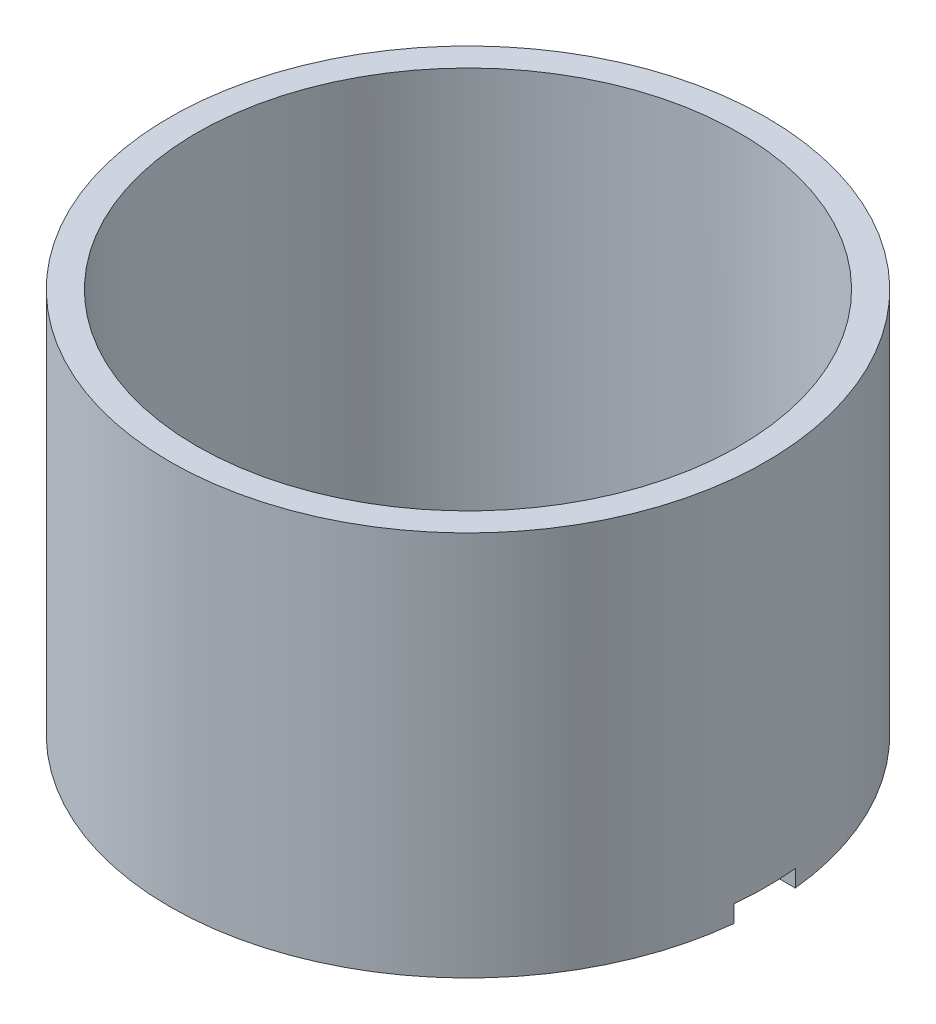
ISO-10303-21;
HEADER;
FILE_DESCRIPTION(('STEP AP214'),'2;1');
FILE_NAME('part.step','',(''),(''),'','','');
FILE_SCHEMA(('AUTOMOTIVE_DESIGN { 1 0 10303 214 1 1 1 1 }'));
ENDSEC;
DATA;
#1=APPLICATION_CONTEXT('core data for automotive mechanical design processes');
#2=APPLICATION_PROTOCOL_DEFINITION('international standard','automotive_design',2000,#1);
#3=PRODUCT_CONTEXT('',#1,'mechanical');
#4=PRODUCT('Part','Part','',(#3));
#5=PRODUCT_RELATED_PRODUCT_CATEGORY('part','',(#4));
#6=PRODUCT_DEFINITION_FORMATION('','',#4);
#7=PRODUCT_DEFINITION_CONTEXT('part definition',#1,'design');
#8=PRODUCT_DEFINITION('design','',#6,#7);
#9=PRODUCT_DEFINITION_SHAPE('','',#8);
#10=(LENGTH_UNIT() NAMED_UNIT(*) SI_UNIT(.MILLI.,.METRE.));
#11=(NAMED_UNIT(*) PLANE_ANGLE_UNIT() SI_UNIT($,.RADIAN.));
#12=(NAMED_UNIT(*) SI_UNIT($,.STERADIAN.) SOLID_ANGLE_UNIT());
#13=UNCERTAINTY_MEASURE_WITH_UNIT(LENGTH_MEASURE(1.E-05),#10,'distance_accuracy_value','');
#14=(GEOMETRIC_REPRESENTATION_CONTEXT(3) GLOBAL_UNCERTAINTY_ASSIGNED_CONTEXT((#13)) GLOBAL_UNIT_ASSIGNED_CONTEXT((#10,
#11,#12)) REPRESENTATION_CONTEXT('',''));
#15=CARTESIAN_POINT('',(0.,0.,0.));
#16=DIRECTION('',(0.,0.,1.));
#17=DIRECTION('',(1.,0.,0.));
#18=AXIS2_PLACEMENT_3D('',#15,#16,#17);
#19=CARTESIAN_POINT('',(0.,-0.6,0.));
#20=DIRECTION('',(0.,1.,0.));
#21=DIRECTION('',(0.,0.,1.));
#22=AXIS2_PLACEMENT_3D('',#19,#20,#21);
#23=PLANE('',#22);
#24=CARTESIAN_POINT('',(0.,-0.6,0.));
#25=DIRECTION('',(0.,1.,0.));
#26=DIRECTION('',(0.,0.,1.));
#27=AXIS2_PLACEMENT_3D('',#24,#25,#26);
#28=CIRCLE('',#27,10.5);
#29=CARTESIAN_POINT('',(10.4443094553924,-0.6,-1.08));
#30=VERTEX_POINT('',#29);
#31=CARTESIAN_POINT('',(-10.4443094553924,-0.6,-1.08));
#32=VERTEX_POINT('',#31);
#33=EDGE_CURVE('E141',#30,#32,#28,.T.);
#34=ORIENTED_EDGE('',*,*,#33,.F.);
#35=DIRECTION('',(-1.,0.,0.));
#36=VECTOR('',#35,1.);
#37=CARTESIAN_POINT('',(0.,-0.6,-1.08));
#38=LINE('',#37,#36);
#39=CARTESIAN_POINT('',(9.48873542681004,-0.6,-1.08));
#40=VERTEX_POINT('',#39);
#41=EDGE_CURVE('E171',#30,#40,#38,.T.);
#42=ORIENTED_EDGE('',*,*,#41,.T.);
#43=CARTESIAN_POINT('',(0.,-0.6,0.));
#44=DIRECTION('',(0.,1.,0.));
#45=DIRECTION('',(0.,0.,1.));
#46=AXIS2_PLACEMENT_3D('',#43,#44,#45);
#47=CIRCLE('',#46,9.55);
#48=CARTESIAN_POINT('',(-9.48873542681004,-0.6,-1.08));
#49=VERTEX_POINT('',#48);
#50=EDGE_CURVE('E138',#40,#49,#47,.T.);
#51=ORIENTED_EDGE('',*,*,#50,.T.);
#52=EDGE_CURVE('E172',#49,#32,#38,.T.);
#53=ORIENTED_EDGE('',*,*,#52,.T.);
#54=EDGE_LOOP('',(#34,#42,#51,#53));
#55=FACE_BOUND('',#54,.T.);
#56=ADVANCED_FACE('F36',(#55),#23,.F.);
#57=CARTESIAN_POINT('',(0.,-0.6,0.));
#58=DIRECTION('',(0.,1.,0.));
#59=DIRECTION('',(0.,0.,1.));
#60=AXIS2_PLACEMENT_3D('',#57,#58,#59);
#61=CYLINDRICAL_SURFACE('',#60,10.5);
#62=CARTESIAN_POINT('',(0.,0.,0.));
#63=DIRECTION('',(0.,1.,0.));
#64=DIRECTION('',(0.,0.,1.));
#65=AXIS2_PLACEMENT_3D('',#62,#63,#64);
#66=CIRCLE('',#65,10.5);
#67=CARTESIAN_POINT('',(10.4443094553924,0.,-1.08));
#68=VERTEX_POINT('',#67);
#69=CARTESIAN_POINT('',(10.4443094553924,0.,1.08));
#70=VERTEX_POINT('',#69);
#71=EDGE_CURVE('E125',#68,#70,#66,.F.);
#72=ORIENTED_EDGE('',*,*,#71,.F.);
#73=DIRECTION('',(0.,1.,0.));
#74=VECTOR('',#73,1.);
#75=CARTESIAN_POINT('',(10.4443094553924,-0.6,-1.08));
#76=LINE('',#75,#74);
#77=EDGE_CURVE('E164',#30,#68,#76,.T.);
#78=ORIENTED_EDGE('',*,*,#77,.F.);
#79=ORIENTED_EDGE('',*,*,#33,.T.);
#80=DIRECTION('',(0.,1.,0.));
#81=VECTOR('',#80,1.);
#82=CARTESIAN_POINT('',(-10.4443094553924,-0.6,-1.08));
#83=LINE('',#82,#81);
#84=CARTESIAN_POINT('',(-10.4443094553924,0.,-1.08));
#85=VERTEX_POINT('',#84);
#86=EDGE_CURVE('E123',#85,#32,#83,.F.);
#87=ORIENTED_EDGE('',*,*,#86,.F.);
#88=CARTESIAN_POINT('',(-10.4443094553924,0.,1.08));
#89=VERTEX_POINT('',#88);
#90=EDGE_CURVE('E111',#89,#85,#66,.F.);
#91=ORIENTED_EDGE('',*,*,#90,.F.);
#92=DIRECTION('',(0.,1.,0.));
#93=VECTOR('',#92,1.);
#94=CARTESIAN_POINT('',(-10.4443094553924,-0.6,1.08));
#95=LINE('',#94,#93);
#96=CARTESIAN_POINT('',(-10.4443094553924,-0.6,1.08));
#97=VERTEX_POINT('',#96);
#98=EDGE_CURVE('E99',#97,#89,#95,.T.);
#99=ORIENTED_EDGE('',*,*,#98,.F.);
#100=CARTESIAN_POINT('',(10.4443094553924,-0.6,1.08));
#101=VERTEX_POINT('',#100);
#102=EDGE_CURVE('E139',#97,#101,#28,.T.);
#103=ORIENTED_EDGE('',*,*,#102,.T.);
#104=DIRECTION('',(0.,1.,0.));
#105=VECTOR('',#104,1.);
#106=CARTESIAN_POINT('',(10.4443094553924,-0.6,1.08));
#107=LINE('',#106,#105);
#108=EDGE_CURVE('E169',#70,#101,#107,.F.);
#109=ORIENTED_EDGE('',*,*,#108,.F.);
#110=EDGE_LOOP('',(#72,#78,#79,#87,#91,#99,#103,#109));
#111=FACE_BOUND('',#110,.T.);
#112=CARTESIAN_POINT('',(0.,12.97,0.));
#113=DIRECTION('',(0.,1.,0.));
#114=DIRECTION('',(0.,0.,1.));
#115=AXIS2_PLACEMENT_3D('',#112,#113,#114);
#116=CIRCLE('',#115,10.5);
#117=CARTESIAN_POINT('',(0.,12.97,10.5));
#118=VERTEX_POINT('',#117);
#119=EDGE_CURVE('E128',#118,#118,#116,.T.);
#120=ORIENTED_EDGE('',*,*,#119,.F.);
#121=EDGE_LOOP('',(#120));
#122=FACE_BOUND('',#121,.T.);
#123=ADVANCED_FACE('F38',(#111,#122),#61,.T.);
#124=ORIENTED_EDGE('',*,*,#102,.F.);
#125=DIRECTION('',(1.,0.,0.));
#126=VECTOR('',#125,1.);
#127=CARTESIAN_POINT('',(0.,-0.6,1.08));
#128=LINE('',#127,#126);
#129=CARTESIAN_POINT('',(-9.48873542681004,-0.6,1.08));
#130=VERTEX_POINT('',#129);
#131=EDGE_CURVE('E102',#97,#130,#128,.T.);
#132=ORIENTED_EDGE('',*,*,#131,.T.);
#133=CARTESIAN_POINT('',(9.48873542681005,-0.6,1.08));
#134=VERTEX_POINT('',#133);
#135=EDGE_CURVE('E135',#130,#134,#47,.T.);
#136=ORIENTED_EDGE('',*,*,#135,.T.);
#137=EDGE_CURVE('E59',#134,#101,#128,.T.);
#138=ORIENTED_EDGE('',*,*,#137,.T.);
#139=EDGE_LOOP('',(#124,#132,#136,#138));
#140=FACE_BOUND('',#139,.T.);
#141=ADVANCED_FACE('F180',(#140),#23,.F.);
#142=CARTESIAN_POINT('',(0.,-0.6,0.));
#143=DIRECTION('',(0.,1.,0.));
#144=DIRECTION('',(0.,0.,1.));
#145=AXIS2_PLACEMENT_3D('',#142,#143,#144);
#146=CYLINDRICAL_SURFACE('',#145,9.55);
#147=ORIENTED_EDGE('',*,*,#50,.F.);
#148=DIRECTION('',(0.,1.,0.));
#149=VECTOR('',#148,1.);
#150=CARTESIAN_POINT('',(9.48873542681004,-0.6,-1.08));
#151=LINE('',#150,#149);
#152=CARTESIAN_POINT('',(9.48873542681004,0.,-1.08));
#153=VERTEX_POINT('',#152);
#154=EDGE_CURVE('E11',#40,#153,#151,.T.);
#155=ORIENTED_EDGE('',*,*,#154,.T.);
#156=CARTESIAN_POINT('',(0.,0.,0.));
#157=DIRECTION('',(0.,1.,0.));
#158=DIRECTION('',(0.,0.,1.));
#159=AXIS2_PLACEMENT_3D('',#156,#157,#158);
#160=CIRCLE('',#159,9.55);
#161=CARTESIAN_POINT('',(9.48873542681004,0.,1.08));
#162=VERTEX_POINT('',#161);
#163=EDGE_CURVE('E44',#153,#162,#160,.F.);
#164=ORIENTED_EDGE('',*,*,#163,.T.);
#165=DIRECTION('',(0.,1.,0.));
#166=VECTOR('',#165,1.);
#167=CARTESIAN_POINT('',(9.48873542681004,-0.6,1.08));
#168=LINE('',#167,#166);
#169=EDGE_CURVE('E147',#162,#134,#168,.F.);
#170=ORIENTED_EDGE('',*,*,#169,.T.);
#171=ORIENTED_EDGE('',*,*,#135,.F.);
#172=DIRECTION('',(0.,1.,0.));
#173=VECTOR('',#172,1.);
#174=CARTESIAN_POINT('',(-9.48873542681004,-0.6,1.08));
#175=LINE('',#174,#173);
#176=CARTESIAN_POINT('',(-9.48873542681004,0.,1.08));
#177=VERTEX_POINT('',#176);
#178=EDGE_CURVE('E142',#130,#177,#175,.T.);
#179=ORIENTED_EDGE('',*,*,#178,.T.);
#180=CARTESIAN_POINT('',(-9.48873542681004,0.,-1.08));
#181=VERTEX_POINT('',#180);
#182=EDGE_CURVE('E114',#177,#181,#160,.F.);
#183=ORIENTED_EDGE('',*,*,#182,.T.);
#184=DIRECTION('',(0.,1.,0.));
#185=VECTOR('',#184,1.);
#186=CARTESIAN_POINT('',(-9.48873542681004,-0.6,-1.08));
#187=LINE('',#186,#185);
#188=EDGE_CURVE('E145',#181,#49,#187,.F.);
#189=ORIENTED_EDGE('',*,*,#188,.T.);
#190=EDGE_LOOP('',(#147,#155,#164,#170,#171,#179,#183,#189));
#191=FACE_BOUND('',#190,.T.);
#192=CARTESIAN_POINT('',(0.,12.97,0.));
#193=DIRECTION('',(0.,1.,0.));
#194=DIRECTION('',(0.,0.,1.));
#195=AXIS2_PLACEMENT_3D('',#192,#193,#194);
#196=CIRCLE('',#195,9.55);
#197=CARTESIAN_POINT('',(0.,12.97,9.55));
#198=VERTEX_POINT('',#197);
#199=EDGE_CURVE('E124',#198,#198,#196,.T.);
#200=ORIENTED_EDGE('',*,*,#199,.T.);
#201=EDGE_LOOP('',(#200));
#202=FACE_BOUND('',#201,.T.);
#203=ADVANCED_FACE('F152',(#191,#202),#146,.F.);
#204=CARTESIAN_POINT('',(0.,12.97,0.));
#205=DIRECTION('',(0.,1.,0.));
#206=DIRECTION('',(0.,0.,1.));
#207=AXIS2_PLACEMENT_3D('',#204,#205,#206);
#208=PLANE('',#207);
#209=ORIENTED_EDGE('',*,*,#119,.T.);
#210=EDGE_LOOP('',(#209));
#211=FACE_BOUND('',#210,.T.);
#212=ORIENTED_EDGE('',*,*,#199,.F.);
#213=EDGE_LOOP('',(#212));
#214=FACE_BOUND('',#213,.T.);
#215=ADVANCED_FACE('F201',(#211,#214),#208,.T.);
#216=CARTESIAN_POINT('',(-10.5,-0.617422302791579,-1.08));
#217=DIRECTION('',(0.,0.,-1.));
#218=DIRECTION('',(-1.,0.,0.));
#219=AXIS2_PLACEMENT_3D('',#216,#217,#218);
#220=PLANE('',#219);
#221=ORIENTED_EDGE('',*,*,#86,.T.);
#222=ORIENTED_EDGE('',*,*,#52,.F.);
#223=ORIENTED_EDGE('',*,*,#188,.F.);
#224=DIRECTION('',(1.,0.,0.));
#225=VECTOR('',#224,1.);
#226=CARTESIAN_POINT('',(-10.5,0.,-1.08));
#227=LINE('',#226,#225);
#228=EDGE_CURVE('E165',#85,#181,#227,.T.);
#229=ORIENTED_EDGE('',*,*,#228,.F.);
#230=EDGE_LOOP('',(#221,#222,#223,#229));
#231=FACE_BOUND('',#230,.T.);
#232=ADVANCED_FACE('F178',(#231),#220,.F.);
#233=CARTESIAN_POINT('',(-10.5,-0.617422302791579,1.08));
#234=DIRECTION('',(0.,0.,1.));
#235=DIRECTION('',(1.,0.,0.));
#236=AXIS2_PLACEMENT_3D('',#233,#234,#235);
#237=PLANE('',#236);
#238=ORIENTED_EDGE('',*,*,#98,.T.);
#239=DIRECTION('',(1.,0.,0.));
#240=VECTOR('',#239,1.);
#241=CARTESIAN_POINT('',(-10.5,0.,1.08));
#242=LINE('',#241,#240);
#243=EDGE_CURVE('E51',#89,#177,#242,.T.);
#244=ORIENTED_EDGE('',*,*,#243,.T.);
#245=ORIENTED_EDGE('',*,*,#178,.F.);
#246=ORIENTED_EDGE('',*,*,#131,.F.);
#247=EDGE_LOOP('',(#238,#244,#245,#246));
#248=FACE_BOUND('',#247,.T.);
#249=ADVANCED_FACE('F100',(#248),#237,.F.);
#250=CARTESIAN_POINT('',(-10.5,0.,1.08));
#251=DIRECTION('',(0.,1.,0.));
#252=DIRECTION('',(0.,0.,1.));
#253=AXIS2_PLACEMENT_3D('',#250,#251,#252);
#254=PLANE('',#253);
#255=ORIENTED_EDGE('',*,*,#90,.T.);
#256=ORIENTED_EDGE('',*,*,#228,.T.);
#257=ORIENTED_EDGE('',*,*,#182,.F.);
#258=ORIENTED_EDGE('',*,*,#243,.F.);
#259=EDGE_LOOP('',(#255,#256,#257,#258));
#260=FACE_BOUND('',#259,.T.);
#261=ADVANCED_FACE('F109',(#260),#254,.F.);
#262=ORIENTED_EDGE('',*,*,#71,.T.);
#263=EDGE_CURVE('E117',#162,#70,#242,.T.);
#264=ORIENTED_EDGE('',*,*,#263,.F.);
#265=ORIENTED_EDGE('',*,*,#163,.F.);
#266=EDGE_CURVE('E116',#153,#68,#227,.T.);
#267=ORIENTED_EDGE('',*,*,#266,.T.);
#268=EDGE_LOOP('',(#262,#264,#265,#267));
#269=FACE_BOUND('',#268,.T.);
#270=ADVANCED_FACE('F158',(#269),#254,.F.);
#271=ORIENTED_EDGE('',*,*,#108,.T.);
#272=ORIENTED_EDGE('',*,*,#137,.F.);
#273=ORIENTED_EDGE('',*,*,#169,.F.);
#274=ORIENTED_EDGE('',*,*,#263,.T.);
#275=EDGE_LOOP('',(#271,#272,#273,#274));
#276=FACE_BOUND('',#275,.T.);
#277=ADVANCED_FACE('F182',(#276),#237,.F.);
#278=ORIENTED_EDGE('',*,*,#77,.T.);
#279=ORIENTED_EDGE('',*,*,#266,.F.);
#280=ORIENTED_EDGE('',*,*,#154,.F.);
#281=ORIENTED_EDGE('',*,*,#41,.F.);
#282=EDGE_LOOP('',(#278,#279,#280,#281));
#283=FACE_BOUND('',#282,.T.);
#284=ADVANCED_FACE('F161',(#283),#220,.F.);
#285=CLOSED_SHELL('',(#56,#123,#141,#203,#215,#232,#249,#261,#270,#277,#284));
#286=MANIFOLD_SOLID_BREP('B2',#285);
#287=ADVANCED_BREP_SHAPE_REPRESENTATION('',(#18,#286),#14);
#288=SHAPE_DEFINITION_REPRESENTATION(#9,#287);
ENDSEC;
END-ISO-10303-21;
